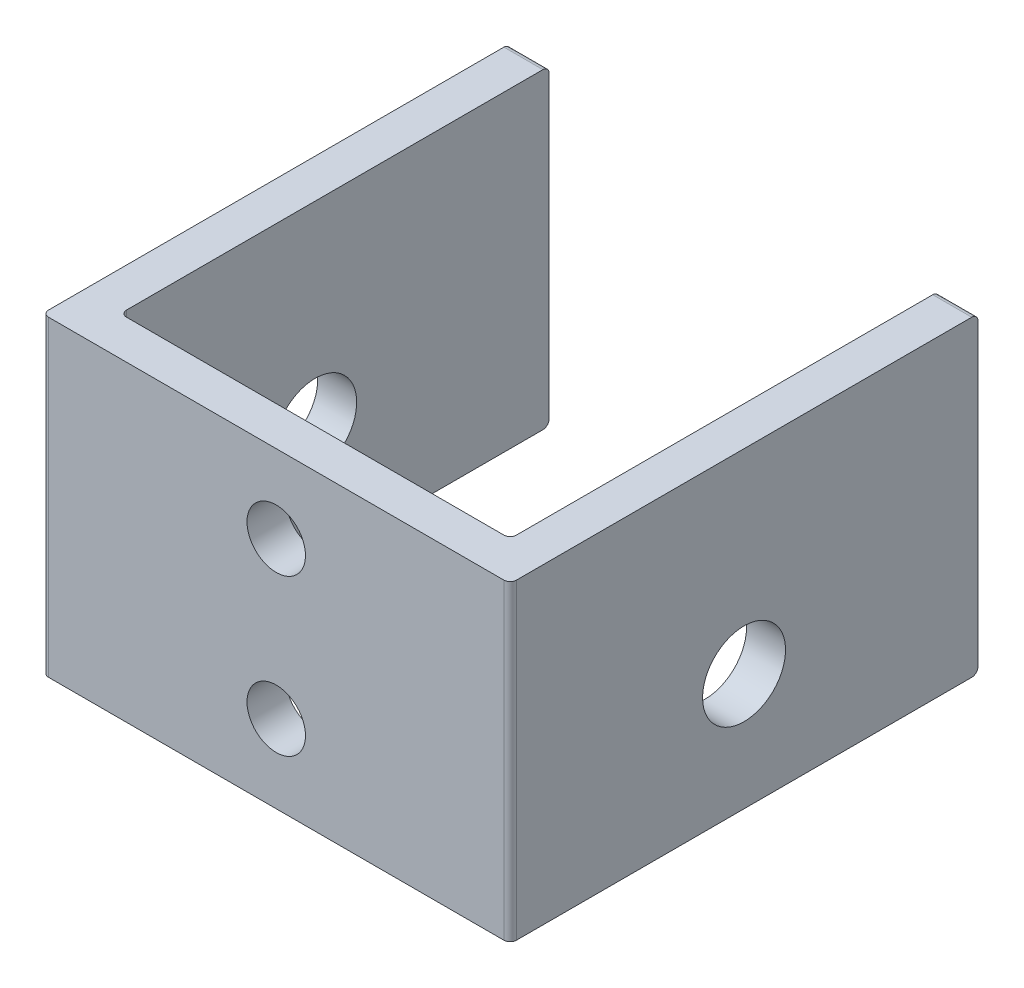
ISO-10303-21;
HEADER;
FILE_DESCRIPTION(('STEP AP214'),'2;1');
FILE_NAME('part.step','',(''),(''),'','','');
FILE_SCHEMA(('AUTOMOTIVE_DESIGN { 1 0 10303 214 1 1 1 1 }'));
ENDSEC;
DATA;
#1=APPLICATION_CONTEXT('core data for automotive mechanical design processes');
#2=APPLICATION_PROTOCOL_DEFINITION('international standard','automotive_design',2000,#1);
#3=PRODUCT_CONTEXT('',#1,'mechanical');
#4=PRODUCT('Part','Part','',(#3));
#5=PRODUCT_RELATED_PRODUCT_CATEGORY('part','',(#4));
#6=PRODUCT_DEFINITION_FORMATION('','',#4);
#7=PRODUCT_DEFINITION_CONTEXT('part definition',#1,'design');
#8=PRODUCT_DEFINITION('design','',#6,#7);
#9=PRODUCT_DEFINITION_SHAPE('','',#8);
#10=(LENGTH_UNIT() NAMED_UNIT(*) SI_UNIT(.MILLI.,.METRE.));
#11=(NAMED_UNIT(*) PLANE_ANGLE_UNIT() SI_UNIT($,.RADIAN.));
#12=(NAMED_UNIT(*) SI_UNIT($,.STERADIAN.) SOLID_ANGLE_UNIT());
#13=UNCERTAINTY_MEASURE_WITH_UNIT(LENGTH_MEASURE(1.E-05),#10,'distance_accuracy_value','');
#14=(GEOMETRIC_REPRESENTATION_CONTEXT(3) GLOBAL_UNCERTAINTY_ASSIGNED_CONTEXT((#13)) GLOBAL_UNIT_ASSIGNED_CONTEXT((#10,
#11,#12)) REPRESENTATION_CONTEXT('',''));
#15=CARTESIAN_POINT('',(0.,0.,0.));
#16=DIRECTION('',(0.,0.,1.));
#17=DIRECTION('',(1.,0.,0.));
#18=AXIS2_PLACEMENT_3D('',#15,#16,#17);
#19=CARTESIAN_POINT('',(19.05,25.4,-19.05));
#20=DIRECTION('',(-1.,0.,0.));
#21=DIRECTION('',(0.,0.,1.));
#22=AXIS2_PLACEMENT_3D('',#19,#20,#21);
#23=PLANE('',#22);
#24=CARTESIAN_POINT('',(19.05,9.525,0.00254000000000105));
#25=DIRECTION('',(-1.,0.,0.));
#26=DIRECTION('',(0.,0.,1.));
#27=AXIS2_PLACEMENT_3D('',#24,#25,#26);
#28=CIRCLE('',#27,3.37819999999999);
#29=CARTESIAN_POINT('',(19.05,9.525,3.38073999999999));
#30=VERTEX_POINT('',#29);
#31=EDGE_CURVE('E524',#30,#30,#28,.T.);
#32=ORIENTED_EDGE('',*,*,#31,.T.);
#33=EDGE_LOOP('',(#32));
#34=FACE_BOUND('',#33,.T.);
#35=DIRECTION('',(0.,0.,-1.));
#36=VECTOR('',#35,1.);
#37=CARTESIAN_POINT('',(19.05,25.4,-19.05));
#38=LINE('',#37,#36);
#39=CARTESIAN_POINT('',(19.05,25.4,18.542));
#40=VERTEX_POINT('',#39);
#41=CARTESIAN_POINT('',(19.05,25.4,-18.542));
#42=VERTEX_POINT('',#41);
#43=EDGE_CURVE('E168',#40,#42,#38,.T.);
#44=ORIENTED_EDGE('',*,*,#43,.F.);
#45=DIRECTION('',(0.,-1.,0.));
#46=VECTOR('',#45,1.);
#47=CARTESIAN_POINT('',(19.05,25.4,18.542));
#48=LINE('',#47,#46);
#49=CARTESIAN_POINT('',(19.05,0.,18.542));
#50=VERTEX_POINT('',#49);
#51=EDGE_CURVE('E153',#40,#50,#48,.T.);
#52=ORIENTED_EDGE('',*,*,#51,.T.);
#53=DIRECTION('',(0.,0.,-1.));
#54=VECTOR('',#53,1.);
#55=CARTESIAN_POINT('',(19.05,0.,-19.05));
#56=LINE('',#55,#54);
#57=CARTESIAN_POINT('',(19.05,0.,-18.542));
#58=VERTEX_POINT('',#57);
#59=EDGE_CURVE('E165',#50,#58,#56,.T.);
#60=ORIENTED_EDGE('',*,*,#59,.T.);
#61=CARTESIAN_POINT('',(19.05,0.508000000000002,-18.542));
#62=DIRECTION('',(-1.,0.,0.));
#63=DIRECTION('',(0.,0.,1.));
#64=AXIS2_PLACEMENT_3D('',#61,#62,#63);
#65=CIRCLE('',#64,0.508);
#66=CARTESIAN_POINT('',(19.05,0.508000000000002,-19.05));
#67=VERTEX_POINT('',#66);
#68=EDGE_CURVE('E170',#58,#67,#65,.F.);
#69=ORIENTED_EDGE('',*,*,#68,.T.);
#70=DIRECTION('',(0.,-1.,0.));
#71=VECTOR('',#70,1.);
#72=CARTESIAN_POINT('',(19.05,25.4,-19.05));
#73=LINE('',#72,#71);
#74=CARTESIAN_POINT('',(19.05,24.892,-19.05));
#75=VERTEX_POINT('',#74);
#76=EDGE_CURVE('E206',#75,#67,#73,.T.);
#77=ORIENTED_EDGE('',*,*,#76,.F.);
#78=CARTESIAN_POINT('',(19.05,24.892,-18.542));
#79=DIRECTION('',(-1.,0.,0.));
#80=DIRECTION('',(0.,0.,1.));
#81=AXIS2_PLACEMENT_3D('',#78,#79,#80);
#82=CIRCLE('',#81,0.508);
#83=EDGE_CURVE('E209',#75,#42,#82,.F.);
#84=ORIENTED_EDGE('',*,*,#83,.T.);
#85=EDGE_LOOP('',(#44,#52,#60,#69,#77,#84));
#86=FACE_BOUND('',#85,.T.);
#87=ADVANCED_FACE('F35',(#34,#86),#23,.F.);
#88=CARTESIAN_POINT('',(19.05,25.4,-19.05));
#89=DIRECTION('',(0.,0.,1.));
#90=DIRECTION('',(1.,0.,0.));
#91=AXIS2_PLACEMENT_3D('',#88,#89,#90);
#92=PLANE('',#91);
#93=ORIENTED_EDGE('',*,*,#76,.T.);
#94=DIRECTION('',(-1.,0.,0.));
#95=VECTOR('',#94,1.);
#96=CARTESIAN_POINT('',(19.05,0.508000000000002,-19.05));
#97=LINE('',#96,#95);
#98=CARTESIAN_POINT('',(15.875,0.508000000000002,-19.05));
#99=VERTEX_POINT('',#98);
#100=EDGE_CURVE('E252',#67,#99,#97,.T.);
#101=ORIENTED_EDGE('',*,*,#100,.T.);
#102=DIRECTION('',(0.,-1.,0.));
#103=VECTOR('',#102,1.);
#104=CARTESIAN_POINT('',(15.875,25.4,-19.05));
#105=LINE('',#104,#103);
#106=CARTESIAN_POINT('',(15.875,24.892,-19.05));
#107=VERTEX_POINT('',#106);
#108=EDGE_CURVE('E204',#107,#99,#105,.T.);
#109=ORIENTED_EDGE('',*,*,#108,.F.);
#110=DIRECTION('',(-1.,0.,0.));
#111=VECTOR('',#110,1.);
#112=CARTESIAN_POINT('',(19.05,24.892,-19.05));
#113=LINE('',#112,#111);
#114=EDGE_CURVE('E250',#107,#75,#113,.F.);
#115=ORIENTED_EDGE('',*,*,#114,.T.);
#116=EDGE_LOOP('',(#93,#101,#109,#115));
#117=FACE_BOUND('',#116,.T.);
#118=ADVANCED_FACE('F331',(#117),#92,.F.);
#119=CARTESIAN_POINT('',(15.875,25.4,-19.05));
#120=DIRECTION('',(1.,0.,0.));
#121=DIRECTION('',(0.,0.,-1.));
#122=AXIS2_PLACEMENT_3D('',#119,#120,#121);
#123=PLANE('',#122);
#124=CARTESIAN_POINT('',(15.875,9.525,0.00254000000000209));
#125=DIRECTION('',(1.,0.,0.));
#126=DIRECTION('',(0.,0.,-1.));
#127=AXIS2_PLACEMENT_3D('',#124,#125,#126);
#128=CIRCLE('',#127,3.37819999999999);
#129=CARTESIAN_POINT('',(15.875,9.525,-3.37565999999999));
#130=VERTEX_POINT('',#129);
#131=EDGE_CURVE('E176',#130,#130,#128,.T.);
#132=ORIENTED_EDGE('',*,*,#131,.T.);
#133=EDGE_LOOP('',(#132));
#134=FACE_BOUND('',#133,.T.);
#135=DIRECTION('',(0.,0.,1.));
#136=VECTOR('',#135,1.);
#137=CARTESIAN_POINT('',(15.875,0.,-19.05));
#138=LINE('',#137,#136);
#139=CARTESIAN_POINT('',(15.875,0.,-18.542));
#140=VERTEX_POINT('',#139);
#141=CARTESIAN_POINT('',(15.875,0.,15.367));
#142=VERTEX_POINT('',#141);
#143=EDGE_CURVE('E175',#140,#142,#138,.T.);
#144=ORIENTED_EDGE('',*,*,#143,.T.);
#145=DIRECTION('',(0.,-1.,0.));
#146=VECTOR('',#145,1.);
#147=CARTESIAN_POINT('',(15.875,25.4,15.367));
#148=LINE('',#147,#146);
#149=CARTESIAN_POINT('',(15.875,25.4,15.367));
#150=VERTEX_POINT('',#149);
#151=EDGE_CURVE('E248',#142,#150,#148,.F.);
#152=ORIENTED_EDGE('',*,*,#151,.T.);
#153=DIRECTION('',(0.,0.,1.));
#154=VECTOR('',#153,1.);
#155=CARTESIAN_POINT('',(15.875,25.4,-19.05));
#156=LINE('',#155,#154);
#157=CARTESIAN_POINT('',(15.875,25.4,-18.542));
#158=VERTEX_POINT('',#157);
#159=EDGE_CURVE('E277',#158,#150,#156,.T.);
#160=ORIENTED_EDGE('',*,*,#159,.F.);
#161=CARTESIAN_POINT('',(15.875,24.892,-18.542));
#162=DIRECTION('',(1.,0.,0.));
#163=DIRECTION('',(0.,0.,-1.));
#164=AXIS2_PLACEMENT_3D('',#161,#162,#163);
#165=CIRCLE('',#164,0.508);
#166=EDGE_CURVE('E58',#158,#107,#165,.F.);
#167=ORIENTED_EDGE('',*,*,#166,.T.);
#168=ORIENTED_EDGE('',*,*,#108,.T.);
#169=CARTESIAN_POINT('',(15.875,0.508000000000002,-18.542));
#170=DIRECTION('',(1.,0.,0.));
#171=DIRECTION('',(0.,0.,-1.));
#172=AXIS2_PLACEMENT_3D('',#169,#170,#171);
#173=CIRCLE('',#172,0.508);
#174=EDGE_CURVE('E50',#99,#140,#173,.F.);
#175=ORIENTED_EDGE('',*,*,#174,.T.);
#176=EDGE_LOOP('',(#144,#152,#160,#167,#168,#175));
#177=FACE_BOUND('',#176,.T.);
#178=ADVANCED_FACE('F266',(#134,#177),#123,.F.);
#179=CARTESIAN_POINT('',(-15.875,25.4,15.875));
#180=DIRECTION('',(0.,0.,1.));
#181=DIRECTION('',(1.,0.,0.));
#182=AXIS2_PLACEMENT_3D('',#179,#180,#181);
#183=PLANE('',#182);
#184=CARTESIAN_POINT('',(0.,6.35,15.875));
#185=DIRECTION('',(0.,0.,-1.));
#186=DIRECTION('',(-1.,0.,0.));
#187=AXIS2_PLACEMENT_3D('',#184,#185,#186);
#188=CIRCLE('',#187,2.38124999999999);
#189=CARTESIAN_POINT('',(-2.38124999999999,6.35,15.875));
#190=VERTEX_POINT('',#189);
#191=EDGE_CURVE('E538',#190,#190,#188,.T.);
#192=ORIENTED_EDGE('',*,*,#191,.F.);
#193=EDGE_LOOP('',(#192));
#194=FACE_BOUND('',#193,.T.);
#195=CARTESIAN_POINT('',(0.,19.05,15.875));
#196=DIRECTION('',(0.,0.,-1.));
#197=DIRECTION('',(-1.,0.,0.));
#198=AXIS2_PLACEMENT_3D('',#195,#196,#197);
#199=CIRCLE('',#198,2.38124999999999);
#200=CARTESIAN_POINT('',(-2.38124999999999,19.05,15.875));
#201=VERTEX_POINT('',#200);
#202=EDGE_CURVE('E532',#201,#201,#199,.T.);
#203=ORIENTED_EDGE('',*,*,#202,.F.);
#204=EDGE_LOOP('',(#203));
#205=FACE_BOUND('',#204,.T.);
#206=DIRECTION('',(-1.,0.,0.));
#207=VECTOR('',#206,1.);
#208=CARTESIAN_POINT('',(-15.875,0.,15.875));
#209=LINE('',#208,#207);
#210=CARTESIAN_POINT('',(15.367,0.,15.875));
#211=VERTEX_POINT('',#210);
#212=CARTESIAN_POINT('',(-15.367,0.,15.875));
#213=VERTEX_POINT('',#212);
#214=EDGE_CURVE('E179',#211,#213,#209,.T.);
#215=ORIENTED_EDGE('',*,*,#214,.T.);
#216=DIRECTION('',(0.,-1.,0.));
#217=VECTOR('',#216,1.);
#218=CARTESIAN_POINT('',(-15.367,25.4,15.875));
#219=LINE('',#218,#217);
#220=CARTESIAN_POINT('',(-15.367,25.4,15.875));
#221=VERTEX_POINT('',#220);
#222=EDGE_CURVE('E244',#213,#221,#219,.F.);
#223=ORIENTED_EDGE('',*,*,#222,.T.);
#224=DIRECTION('',(-1.,0.,0.));
#225=VECTOR('',#224,1.);
#226=CARTESIAN_POINT('',(-15.875,25.4,15.875));
#227=LINE('',#226,#225);
#228=CARTESIAN_POINT('',(15.367,25.4,15.875));
#229=VERTEX_POINT('',#228);
#230=EDGE_CURVE('E275',#229,#221,#227,.T.);
#231=ORIENTED_EDGE('',*,*,#230,.F.);
#232=DIRECTION('',(0.,-1.,0.));
#233=VECTOR('',#232,1.);
#234=CARTESIAN_POINT('',(15.367,0.,15.875));
#235=LINE('',#234,#233);
#236=EDGE_CURVE('E241',#229,#211,#235,.T.);
#237=ORIENTED_EDGE('',*,*,#236,.T.);
#238=EDGE_LOOP('',(#215,#223,#231,#237));
#239=FACE_BOUND('',#238,.T.);
#240=ADVANCED_FACE('F279',(#194,#205,#239),#183,.F.);
#241=CARTESIAN_POINT('',(-15.875,25.4,-19.05));
#242=DIRECTION('',(-1.,0.,0.));
#243=DIRECTION('',(0.,0.,1.));
#244=AXIS2_PLACEMENT_3D('',#241,#242,#243);
#245=PLANE('',#244);
#246=CARTESIAN_POINT('',(-15.875,9.525,0.0025400000000125));
#247=DIRECTION('',(-1.,0.,0.));
#248=DIRECTION('',(0.,0.,1.));
#249=AXIS2_PLACEMENT_3D('',#246,#247,#248);
#250=CIRCLE('',#249,3.37819999999999);
#251=CARTESIAN_POINT('',(-15.875,9.525,3.38074000000001));
#252=VERTEX_POINT('',#251);
#253=EDGE_CURVE('E182',#252,#252,#250,.T.);
#254=ORIENTED_EDGE('',*,*,#253,.T.);
#255=EDGE_LOOP('',(#254));
#256=FACE_BOUND('',#255,.T.);
#257=DIRECTION('',(0.,0.,-1.));
#258=VECTOR('',#257,1.);
#259=CARTESIAN_POINT('',(-15.875,25.4,-19.05));
#260=LINE('',#259,#258);
#261=CARTESIAN_POINT('',(-15.875,25.4,15.367));
#262=VERTEX_POINT('',#261);
#263=CARTESIAN_POINT('',(-15.875,25.4,-18.542));
#264=VERTEX_POINT('',#263);
#265=EDGE_CURVE('E281',#262,#264,#260,.T.);
#266=ORIENTED_EDGE('',*,*,#265,.F.);
#267=DIRECTION('',(0.,-1.,0.));
#268=VECTOR('',#267,1.);
#269=CARTESIAN_POINT('',(-15.875,0.,15.367));
#270=LINE('',#269,#268);
#271=CARTESIAN_POINT('',(-15.875,0.,15.367));
#272=VERTEX_POINT('',#271);
#273=EDGE_CURVE('E238',#262,#272,#270,.T.);
#274=ORIENTED_EDGE('',*,*,#273,.T.);
#275=DIRECTION('',(0.,0.,-1.));
#276=VECTOR('',#275,1.);
#277=CARTESIAN_POINT('',(-15.875,0.,-19.05));
#278=LINE('',#277,#276);
#279=CARTESIAN_POINT('',(-15.875,0.,-18.542));
#280=VERTEX_POINT('',#279);
#281=EDGE_CURVE('E190',#272,#280,#278,.T.);
#282=ORIENTED_EDGE('',*,*,#281,.T.);
#283=CARTESIAN_POINT('',(-15.875,0.508000000000002,-18.542));
#284=DIRECTION('',(-1.,0.,0.));
#285=DIRECTION('',(0.,0.,1.));
#286=AXIS2_PLACEMENT_3D('',#283,#284,#285);
#287=CIRCLE('',#286,0.508);
#288=CARTESIAN_POINT('',(-15.875,0.508000000000002,-19.05));
#289=VERTEX_POINT('',#288);
#290=EDGE_CURVE('E234',#280,#289,#287,.F.);
#291=ORIENTED_EDGE('',*,*,#290,.T.);
#292=DIRECTION('',(0.,-1.,0.));
#293=VECTOR('',#292,1.);
#294=CARTESIAN_POINT('',(-15.875,25.4,-19.05));
#295=LINE('',#294,#293);
#296=CARTESIAN_POINT('',(-15.875,24.892,-19.05));
#297=VERTEX_POINT('',#296);
#298=EDGE_CURVE('E201',#297,#289,#295,.T.);
#299=ORIENTED_EDGE('',*,*,#298,.F.);
#300=CARTESIAN_POINT('',(-15.875,24.892,-18.542));
#301=DIRECTION('',(-1.,0.,0.));
#302=DIRECTION('',(0.,0.,1.));
#303=AXIS2_PLACEMENT_3D('',#300,#301,#302);
#304=CIRCLE('',#303,0.508);
#305=EDGE_CURVE('E236',#297,#264,#304,.F.);
#306=ORIENTED_EDGE('',*,*,#305,.T.);
#307=EDGE_LOOP('',(#266,#274,#282,#291,#299,#306));
#308=FACE_BOUND('',#307,.T.);
#309=ADVANCED_FACE('F313',(#256,#308),#245,.F.);
#310=CARTESIAN_POINT('',(-19.05,25.4,-19.05));
#311=DIRECTION('',(0.,0.,1.));
#312=DIRECTION('',(1.,0.,0.));
#313=AXIS2_PLACEMENT_3D('',#310,#311,#312);
#314=PLANE('',#313);
#315=DIRECTION('',(0.,-1.,0.));
#316=VECTOR('',#315,1.);
#317=CARTESIAN_POINT('',(-19.05,25.4,-19.05));
#318=LINE('',#317,#316);
#319=CARTESIAN_POINT('',(-19.05,24.892,-19.05));
#320=VERTEX_POINT('',#319);
#321=CARTESIAN_POINT('',(-19.05,0.508000000000002,-19.05));
#322=VERTEX_POINT('',#321);
#323=EDGE_CURVE('E198',#320,#322,#318,.T.);
#324=ORIENTED_EDGE('',*,*,#323,.F.);
#325=DIRECTION('',(-1.,0.,0.));
#326=VECTOR('',#325,1.);
#327=CARTESIAN_POINT('',(-15.875,24.892,-19.05));
#328=LINE('',#327,#326);
#329=EDGE_CURVE('E257',#320,#297,#328,.F.);
#330=ORIENTED_EDGE('',*,*,#329,.T.);
#331=ORIENTED_EDGE('',*,*,#298,.T.);
#332=DIRECTION('',(-1.,0.,0.));
#333=VECTOR('',#332,1.);
#334=CARTESIAN_POINT('',(-19.05,0.508000000000002,-19.05));
#335=LINE('',#334,#333);
#336=EDGE_CURVE('E254',#289,#322,#335,.T.);
#337=ORIENTED_EDGE('',*,*,#336,.T.);
#338=EDGE_LOOP('',(#324,#330,#331,#337));
#339=FACE_BOUND('',#338,.T.);
#340=ADVANCED_FACE('F307',(#339),#314,.F.);
#341=CARTESIAN_POINT('',(-19.05,25.4,-19.05));
#342=DIRECTION('',(1.,0.,0.));
#343=DIRECTION('',(0.,0.,-1.));
#344=AXIS2_PLACEMENT_3D('',#341,#342,#343);
#345=PLANE('',#344);
#346=CARTESIAN_POINT('',(-19.05,9.525,0.00254000000001354));
#347=DIRECTION('',(-1.,0.,0.));
#348=DIRECTION('',(0.,0.,1.));
#349=AXIS2_PLACEMENT_3D('',#346,#347,#348);
#350=CIRCLE('',#349,3.3782);
#351=CARTESIAN_POINT('',(-19.05,9.525,3.38074000000001));
#352=VERTEX_POINT('',#351);
#353=EDGE_CURVE('E526',#352,#352,#350,.T.);
#354=ORIENTED_EDGE('',*,*,#353,.F.);
#355=EDGE_LOOP('',(#354));
#356=FACE_BOUND('',#355,.T.);
#357=DIRECTION('',(0.,0.,1.));
#358=VECTOR('',#357,1.);
#359=CARTESIAN_POINT('',(-19.05,0.,-19.05));
#360=LINE('',#359,#358);
#361=CARTESIAN_POINT('',(-19.05,0.,-18.542));
#362=VERTEX_POINT('',#361);
#363=CARTESIAN_POINT('',(-19.05,0.,18.542));
#364=VERTEX_POINT('',#363);
#365=EDGE_CURVE('E193',#362,#364,#360,.T.);
#366=ORIENTED_EDGE('',*,*,#365,.T.);
#367=DIRECTION('',(0.,-1.,0.));
#368=VECTOR('',#367,1.);
#369=CARTESIAN_POINT('',(-19.05,25.4,18.542));
#370=LINE('',#369,#368);
#371=CARTESIAN_POINT('',(-19.05,25.4,18.542));
#372=VERTEX_POINT('',#371);
#373=EDGE_CURVE('E232',#364,#372,#370,.F.);
#374=ORIENTED_EDGE('',*,*,#373,.T.);
#375=DIRECTION('',(0.,0.,1.));
#376=VECTOR('',#375,1.);
#377=CARTESIAN_POINT('',(-19.05,25.4,-19.05));
#378=LINE('',#377,#376);
#379=CARTESIAN_POINT('',(-19.05,25.4,-18.542));
#380=VERTEX_POINT('',#379);
#381=EDGE_CURVE('E284',#380,#372,#378,.T.);
#382=ORIENTED_EDGE('',*,*,#381,.F.);
#383=CARTESIAN_POINT('',(-19.05,24.892,-18.542));
#384=DIRECTION('',(1.,0.,0.));
#385=DIRECTION('',(0.,0.,-1.));
#386=AXIS2_PLACEMENT_3D('',#383,#384,#385);
#387=CIRCLE('',#386,0.508);
#388=EDGE_CURVE('E230',#380,#320,#387,.F.);
#389=ORIENTED_EDGE('',*,*,#388,.T.);
#390=ORIENTED_EDGE('',*,*,#323,.T.);
#391=CARTESIAN_POINT('',(-19.05,0.508000000000002,-18.542));
#392=DIRECTION('',(1.,0.,0.));
#393=DIRECTION('',(0.,0.,-1.));
#394=AXIS2_PLACEMENT_3D('',#391,#392,#393);
#395=CIRCLE('',#394,0.508);
#396=EDGE_CURVE('E228',#322,#362,#395,.F.);
#397=ORIENTED_EDGE('',*,*,#396,.T.);
#398=EDGE_LOOP('',(#366,#374,#382,#389,#390,#397));
#399=FACE_BOUND('',#398,.T.);
#400=ADVANCED_FACE('F301',(#356,#399),#345,.F.);
#401=CARTESIAN_POINT('',(-19.05,25.4,19.05));
#402=DIRECTION('',(0.,0.,-1.));
#403=DIRECTION('',(-1.,0.,0.));
#404=AXIS2_PLACEMENT_3D('',#401,#402,#403);
#405=PLANE('',#404);
#406=CARTESIAN_POINT('',(0.,6.35,19.05));
#407=DIRECTION('',(0.,0.,-1.));
#408=DIRECTION('',(-1.,0.,0.));
#409=AXIS2_PLACEMENT_3D('',#406,#407,#408);
#410=CIRCLE('',#409,2.38125);
#411=CARTESIAN_POINT('',(-2.38125,6.35,19.05));
#412=VERTEX_POINT('',#411);
#413=EDGE_CURVE('E535',#412,#412,#410,.T.);
#414=ORIENTED_EDGE('',*,*,#413,.T.);
#415=EDGE_LOOP('',(#414));
#416=FACE_BOUND('',#415,.T.);
#417=CARTESIAN_POINT('',(0.,19.05,19.05));
#418=DIRECTION('',(0.,0.,-1.));
#419=DIRECTION('',(-1.,0.,0.));
#420=AXIS2_PLACEMENT_3D('',#417,#418,#419);
#421=CIRCLE('',#420,2.38125);
#422=CARTESIAN_POINT('',(-2.38125,19.05,19.05));
#423=VERTEX_POINT('',#422);
#424=EDGE_CURVE('E529',#423,#423,#421,.T.);
#425=ORIENTED_EDGE('',*,*,#424,.T.);
#426=EDGE_LOOP('',(#425));
#427=FACE_BOUND('',#426,.T.);
#428=DIRECTION('',(1.,0.,0.));
#429=VECTOR('',#428,1.);
#430=CARTESIAN_POINT('',(-19.05,0.,19.05));
#431=LINE('',#430,#429);
#432=CARTESIAN_POINT('',(-18.542,0.,19.05));
#433=VERTEX_POINT('',#432);
#434=CARTESIAN_POINT('',(18.542,0.,19.05));
#435=VERTEX_POINT('',#434);
#436=EDGE_CURVE('E196',#433,#435,#431,.T.);
#437=ORIENTED_EDGE('',*,*,#436,.T.);
#438=DIRECTION('',(0.,-1.,0.));
#439=VECTOR('',#438,1.);
#440=CARTESIAN_POINT('',(18.542,25.4,19.05));
#441=LINE('',#440,#439);
#442=CARTESIAN_POINT('',(18.542,25.4,19.05));
#443=VERTEX_POINT('',#442);
#444=EDGE_CURVE('E154',#435,#443,#441,.F.);
#445=ORIENTED_EDGE('',*,*,#444,.T.);
#446=DIRECTION('',(1.,0.,0.));
#447=VECTOR('',#446,1.);
#448=CARTESIAN_POINT('',(-19.05,25.4,19.05));
#449=LINE('',#448,#447);
#450=CARTESIAN_POINT('',(-18.542,25.4,19.05));
#451=VERTEX_POINT('',#450);
#452=EDGE_CURVE('E185',#451,#443,#449,.T.);
#453=ORIENTED_EDGE('',*,*,#452,.F.);
#454=DIRECTION('',(0.,-1.,0.));
#455=VECTOR('',#454,1.);
#456=CARTESIAN_POINT('',(-18.542,25.4,19.05));
#457=LINE('',#456,#455);
#458=EDGE_CURVE('E159',#451,#433,#457,.T.);
#459=ORIENTED_EDGE('',*,*,#458,.T.);
#460=EDGE_LOOP('',(#437,#445,#453,#459));
#461=FACE_BOUND('',#460,.T.);
#462=ADVANCED_FACE('F294',(#416,#427,#461),#405,.F.);
#463=CARTESIAN_POINT('',(0.,25.4,0.));
#464=DIRECTION('',(0.,1.,0.));
#465=DIRECTION('',(0.,0.,1.));
#466=AXIS2_PLACEMENT_3D('',#463,#464,#465);
#467=PLANE('',#466);
#468=ORIENTED_EDGE('',*,*,#452,.T.);
#469=CARTESIAN_POINT('',(18.542,25.4,18.542));
#470=DIRECTION('',(0.,1.,0.));
#471=DIRECTION('',(0.,0.,1.));
#472=AXIS2_PLACEMENT_3D('',#469,#470,#471);
#473=CIRCLE('',#472,0.508);
#474=EDGE_CURVE('E226',#443,#40,#473,.T.);
#475=ORIENTED_EDGE('',*,*,#474,.T.);
#476=ORIENTED_EDGE('',*,*,#43,.T.);
#477=DIRECTION('',(-1.,0.,0.));
#478=VECTOR('',#477,1.);
#479=CARTESIAN_POINT('',(15.875,25.4,-18.542));
#480=LINE('',#479,#478);
#481=EDGE_CURVE('E221',#42,#158,#480,.T.);
#482=ORIENTED_EDGE('',*,*,#481,.T.);
#483=ORIENTED_EDGE('',*,*,#159,.T.);
#484=CARTESIAN_POINT('',(15.367,25.4,15.367));
#485=DIRECTION('',(0.,1.,0.));
#486=DIRECTION('',(0.,0.,1.));
#487=AXIS2_PLACEMENT_3D('',#484,#485,#486);
#488=CIRCLE('',#487,0.508);
#489=EDGE_CURVE('E12',#150,#229,#488,.F.);
#490=ORIENTED_EDGE('',*,*,#489,.T.);
#491=ORIENTED_EDGE('',*,*,#230,.T.);
#492=CARTESIAN_POINT('',(-15.367,25.4,15.367));
#493=DIRECTION('',(0.,1.,0.));
#494=DIRECTION('',(0.,0.,1.));
#495=AXIS2_PLACEMENT_3D('',#492,#493,#494);
#496=CIRCLE('',#495,0.508);
#497=EDGE_CURVE('E261',#221,#262,#496,.F.);
#498=ORIENTED_EDGE('',*,*,#497,.T.);
#499=ORIENTED_EDGE('',*,*,#265,.T.);
#500=DIRECTION('',(-1.,0.,0.));
#501=VECTOR('',#500,1.);
#502=CARTESIAN_POINT('',(-19.05,25.4,-18.542));
#503=LINE('',#502,#501);
#504=EDGE_CURVE('E218',#264,#380,#503,.T.);
#505=ORIENTED_EDGE('',*,*,#504,.T.);
#506=ORIENTED_EDGE('',*,*,#381,.T.);
#507=CARTESIAN_POINT('',(-18.542,25.4,18.542));
#508=DIRECTION('',(0.,1.,0.));
#509=DIRECTION('',(0.,0.,1.));
#510=AXIS2_PLACEMENT_3D('',#507,#508,#509);
#511=CIRCLE('',#510,0.508);
#512=EDGE_CURVE('E224',#372,#451,#511,.T.);
#513=ORIENTED_EDGE('',*,*,#512,.T.);
#514=EDGE_LOOP('',(#468,#475,#476,#482,#483,#490,#491,#498,#499,#505,#506,#513));
#515=FACE_BOUND('',#514,.T.);
#516=ADVANCED_FACE('F274',(#515),#467,.T.);
#517=CARTESIAN_POINT('',(0.,0.,0.));
#518=DIRECTION('',(0.,1.,0.));
#519=DIRECTION('',(0.,0.,1.));
#520=AXIS2_PLACEMENT_3D('',#517,#518,#519);
#521=PLANE('',#520);
#522=ORIENTED_EDGE('',*,*,#59,.F.);
#523=CARTESIAN_POINT('',(18.542,0.,18.542));
#524=DIRECTION('',(0.,1.,0.));
#525=DIRECTION('',(0.,0.,1.));
#526=AXIS2_PLACEMENT_3D('',#523,#524,#525);
#527=CIRCLE('',#526,0.508);
#528=EDGE_CURVE('E149',#50,#435,#527,.F.);
#529=ORIENTED_EDGE('',*,*,#528,.T.);
#530=ORIENTED_EDGE('',*,*,#436,.F.);
#531=CARTESIAN_POINT('',(-18.542,0.,18.542));
#532=DIRECTION('',(0.,1.,0.));
#533=DIRECTION('',(0.,0.,1.));
#534=AXIS2_PLACEMENT_3D('',#531,#532,#533);
#535=CIRCLE('',#534,0.508);
#536=EDGE_CURVE('E160',#433,#364,#535,.F.);
#537=ORIENTED_EDGE('',*,*,#536,.T.);
#538=ORIENTED_EDGE('',*,*,#365,.F.);
#539=DIRECTION('',(-1.,0.,0.));
#540=VECTOR('',#539,1.);
#541=CARTESIAN_POINT('',(0.,0.,-18.542));
#542=LINE('',#541,#540);
#543=EDGE_CURVE('E169',#362,#280,#542,.F.);
#544=ORIENTED_EDGE('',*,*,#543,.T.);
#545=ORIENTED_EDGE('',*,*,#281,.F.);
#546=CARTESIAN_POINT('',(-15.367,0.,15.367));
#547=DIRECTION('',(0.,1.,0.));
#548=DIRECTION('',(0.,0.,1.));
#549=AXIS2_PLACEMENT_3D('',#546,#547,#548);
#550=CIRCLE('',#549,0.508);
#551=EDGE_CURVE('E259',#272,#213,#550,.T.);
#552=ORIENTED_EDGE('',*,*,#551,.T.);
#553=ORIENTED_EDGE('',*,*,#214,.F.);
#554=CARTESIAN_POINT('',(15.367,0.,15.367));
#555=DIRECTION('',(0.,1.,0.));
#556=DIRECTION('',(0.,0.,1.));
#557=AXIS2_PLACEMENT_3D('',#554,#555,#556);
#558=CIRCLE('',#557,0.508);
#559=EDGE_CURVE('E43',#211,#142,#558,.T.);
#560=ORIENTED_EDGE('',*,*,#559,.T.);
#561=ORIENTED_EDGE('',*,*,#143,.F.);
#562=DIRECTION('',(-1.,0.,0.));
#563=VECTOR('',#562,1.);
#564=CARTESIAN_POINT('',(0.,0.,-18.542));
#565=LINE('',#564,#563);
#566=EDGE_CURVE('E174',#140,#58,#565,.F.);
#567=ORIENTED_EDGE('',*,*,#566,.T.);
#568=EDGE_LOOP('',(#522,#529,#530,#537,#538,#544,#545,#552,#553,#560,#561,#567));
#569=FACE_BOUND('',#568,.T.);
#570=ADVANCED_FACE('F172',(#569),#521,.F.);
#571=CARTESIAN_POINT('',(-19.05,9.525,0.00254000000001354));
#572=DIRECTION('',(-1.,0.,0.));
#573=DIRECTION('',(0.,0.,1.));
#574=AXIS2_PLACEMENT_3D('',#571,#572,#573);
#575=CYLINDRICAL_SURFACE('',#574,3.37819999999999);
#576=ORIENTED_EDGE('',*,*,#353,.T.);
#577=EDGE_LOOP('',(#576));
#578=FACE_BOUND('',#577,.T.);
#579=ORIENTED_EDGE('',*,*,#253,.F.);
#580=EDGE_LOOP('',(#579));
#581=FACE_BOUND('',#580,.T.);
#582=ADVANCED_FACE('F361',(#578,#581),#575,.F.);
#583=ORIENTED_EDGE('',*,*,#31,.F.);
#584=EDGE_LOOP('',(#583));
#585=FACE_BOUND('',#584,.T.);
#586=ORIENTED_EDGE('',*,*,#131,.F.);
#587=EDGE_LOOP('',(#586));
#588=FACE_BOUND('',#587,.T.);
#589=ADVANCED_FACE('F353',(#585,#588),#575,.F.);
#590=CARTESIAN_POINT('',(0.,19.05,15.875));
#591=DIRECTION('',(0.,0.,-1.));
#592=DIRECTION('',(-1.,0.,0.));
#593=AXIS2_PLACEMENT_3D('',#590,#591,#592);
#594=CYLINDRICAL_SURFACE('',#593,2.38124999999999);
#595=ORIENTED_EDGE('',*,*,#424,.F.);
#596=EDGE_LOOP('',(#595));
#597=FACE_BOUND('',#596,.T.);
#598=ORIENTED_EDGE('',*,*,#202,.T.);
#599=EDGE_LOOP('',(#598));
#600=FACE_BOUND('',#599,.T.);
#601=ADVANCED_FACE('F347',(#597,#600),#594,.F.);
#602=CARTESIAN_POINT('',(0.,6.35,15.875));
#603=DIRECTION('',(0.,0.,-1.));
#604=DIRECTION('',(-1.,0.,0.));
#605=AXIS2_PLACEMENT_3D('',#602,#603,#604);
#606=CYLINDRICAL_SURFACE('',#605,2.38124999999999);
#607=ORIENTED_EDGE('',*,*,#413,.F.);
#608=EDGE_LOOP('',(#607));
#609=FACE_BOUND('',#608,.T.);
#610=ORIENTED_EDGE('',*,*,#191,.T.);
#611=EDGE_LOOP('',(#610));
#612=FACE_BOUND('',#611,.T.);
#613=ADVANCED_FACE('F343',(#609,#612),#606,.F.);
#614=CARTESIAN_POINT('',(18.542,25.4,18.542));
#615=DIRECTION('',(0.,-1.,0.));
#616=DIRECTION('',(0.,0.,-1.));
#617=AXIS2_PLACEMENT_3D('',#614,#615,#616);
#618=CYLINDRICAL_SURFACE('',#617,0.508);
#619=ORIENTED_EDGE('',*,*,#474,.F.);
#620=ORIENTED_EDGE('',*,*,#444,.F.);
#621=ORIENTED_EDGE('',*,*,#528,.F.);
#622=ORIENTED_EDGE('',*,*,#51,.F.);
#623=EDGE_LOOP('',(#619,#620,#621,#622));
#624=FACE_BOUND('',#623,.T.);
#625=ADVANCED_FACE('F152',(#624),#618,.T.);
#626=CARTESIAN_POINT('',(-18.542,25.4,18.542));
#627=DIRECTION('',(0.,-1.,0.));
#628=DIRECTION('',(0.,0.,-1.));
#629=AXIS2_PLACEMENT_3D('',#626,#627,#628);
#630=CYLINDRICAL_SURFACE('',#629,0.508);
#631=ORIENTED_EDGE('',*,*,#512,.F.);
#632=ORIENTED_EDGE('',*,*,#373,.F.);
#633=ORIENTED_EDGE('',*,*,#536,.F.);
#634=ORIENTED_EDGE('',*,*,#458,.F.);
#635=EDGE_LOOP('',(#631,#632,#633,#634));
#636=FACE_BOUND('',#635,.T.);
#637=ADVANCED_FACE('F296',(#636),#630,.T.);
#638=CARTESIAN_POINT('',(-15.367,25.4,15.367));
#639=DIRECTION('',(0.,1.,0.));
#640=DIRECTION('',(0.,0.,1.));
#641=AXIS2_PLACEMENT_3D('',#638,#639,#640);
#642=CYLINDRICAL_SURFACE('',#641,0.508);
#643=ORIENTED_EDGE('',*,*,#497,.F.);
#644=ORIENTED_EDGE('',*,*,#222,.F.);
#645=ORIENTED_EDGE('',*,*,#551,.F.);
#646=ORIENTED_EDGE('',*,*,#273,.F.);
#647=EDGE_LOOP('',(#643,#644,#645,#646));
#648=FACE_BOUND('',#647,.T.);
#649=ADVANCED_FACE('F320',(#648),#642,.F.);
#650=CARTESIAN_POINT('',(15.367,25.4,15.367));
#651=DIRECTION('',(0.,1.,0.));
#652=DIRECTION('',(0.,0.,1.));
#653=AXIS2_PLACEMENT_3D('',#650,#651,#652);
#654=CYLINDRICAL_SURFACE('',#653,0.508);
#655=ORIENTED_EDGE('',*,*,#489,.F.);
#656=ORIENTED_EDGE('',*,*,#151,.F.);
#657=ORIENTED_EDGE('',*,*,#559,.F.);
#658=ORIENTED_EDGE('',*,*,#236,.F.);
#659=EDGE_LOOP('',(#655,#656,#657,#658));
#660=FACE_BOUND('',#659,.T.);
#661=ADVANCED_FACE('F269',(#660),#654,.F.);
#662=CARTESIAN_POINT('',(19.05,0.508000000000002,-18.542));
#663=DIRECTION('',(-1.,0.,0.));
#664=DIRECTION('',(0.,0.,1.));
#665=AXIS2_PLACEMENT_3D('',#662,#663,#664);
#666=CYLINDRICAL_SURFACE('',#665,0.508);
#667=ORIENTED_EDGE('',*,*,#68,.F.);
#668=ORIENTED_EDGE('',*,*,#566,.F.);
#669=ORIENTED_EDGE('',*,*,#174,.F.);
#670=ORIENTED_EDGE('',*,*,#100,.F.);
#671=EDGE_LOOP('',(#667,#668,#669,#670));
#672=FACE_BOUND('',#671,.T.);
#673=ADVANCED_FACE('F327',(#672),#666,.T.);
#674=CARTESIAN_POINT('',(0.,24.892,-18.542));
#675=DIRECTION('',(1.,0.,0.));
#676=DIRECTION('',(0.,0.,-1.));
#677=AXIS2_PLACEMENT_3D('',#674,#675,#676);
#678=CYLINDRICAL_SURFACE('',#677,0.508);
#679=ORIENTED_EDGE('',*,*,#83,.F.);
#680=ORIENTED_EDGE('',*,*,#114,.F.);
#681=ORIENTED_EDGE('',*,*,#166,.F.);
#682=ORIENTED_EDGE('',*,*,#481,.F.);
#683=EDGE_LOOP('',(#679,#680,#681,#682));
#684=FACE_BOUND('',#683,.T.);
#685=ADVANCED_FACE('F490',(#684),#678,.T.);
#686=CARTESIAN_POINT('',(0.,24.892,-18.542));
#687=DIRECTION('',(1.,0.,0.));
#688=DIRECTION('',(0.,0.,-1.));
#689=AXIS2_PLACEMENT_3D('',#686,#687,#688);
#690=CYLINDRICAL_SURFACE('',#689,0.508);
#691=ORIENTED_EDGE('',*,*,#305,.F.);
#692=ORIENTED_EDGE('',*,*,#329,.F.);
#693=ORIENTED_EDGE('',*,*,#388,.F.);
#694=ORIENTED_EDGE('',*,*,#504,.F.);
#695=EDGE_LOOP('',(#691,#692,#693,#694));
#696=FACE_BOUND('',#695,.T.);
#697=ADVANCED_FACE('F316',(#696),#690,.T.);
#698=CARTESIAN_POINT('',(-19.05,0.508000000000002,-18.542));
#699=DIRECTION('',(-1.,0.,0.));
#700=DIRECTION('',(0.,0.,1.));
#701=AXIS2_PLACEMENT_3D('',#698,#699,#700);
#702=CYLINDRICAL_SURFACE('',#701,0.508);
#703=ORIENTED_EDGE('',*,*,#290,.F.);
#704=ORIENTED_EDGE('',*,*,#543,.F.);
#705=ORIENTED_EDGE('',*,*,#396,.F.);
#706=ORIENTED_EDGE('',*,*,#336,.F.);
#707=EDGE_LOOP('',(#703,#704,#705,#706));
#708=FACE_BOUND('',#707,.T.);
#709=ADVANCED_FACE('F37',(#708),#702,.T.);
#710=CLOSED_SHELL('',(#87,#118,#178,#240,#309,#340,#400,#462,#516,#570,#582,#589,#601,#613,#625,
#637,#649,#661,#673,#685,#697,#709));
#711=MANIFOLD_SOLID_BREP('B2',#710);
#712=ADVANCED_BREP_SHAPE_REPRESENTATION('',(#18,#711),#14);
#713=SHAPE_DEFINITION_REPRESENTATION(#9,#712);
ENDSEC;
END-ISO-10303-21;
